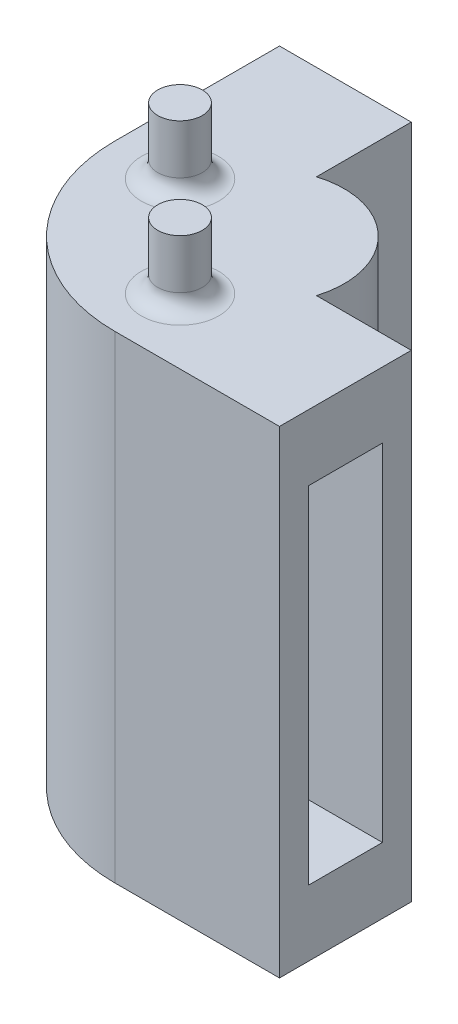
ISO-10303-21;
HEADER;
FILE_DESCRIPTION(('STEP AP214'),'2;1');
FILE_NAME('part.step','',(''),(''),'','','');
FILE_SCHEMA(('AUTOMOTIVE_DESIGN { 1 0 10303 214 1 1 1 1 }'));
ENDSEC;
DATA;
#1=APPLICATION_CONTEXT('core data for automotive mechanical design processes');
#2=APPLICATION_PROTOCOL_DEFINITION('international standard','automotive_design',2000,#1);
#3=PRODUCT_CONTEXT('',#1,'mechanical');
#4=PRODUCT('Part','Part','',(#3));
#5=PRODUCT_RELATED_PRODUCT_CATEGORY('part','',(#4));
#6=PRODUCT_DEFINITION_FORMATION('','',#4);
#7=PRODUCT_DEFINITION_CONTEXT('part definition',#1,'design');
#8=PRODUCT_DEFINITION('design','',#6,#7);
#9=PRODUCT_DEFINITION_SHAPE('','',#8);
#10=(LENGTH_UNIT() NAMED_UNIT(*) SI_UNIT(.MILLI.,.METRE.));
#11=(NAMED_UNIT(*) PLANE_ANGLE_UNIT() SI_UNIT($,.RADIAN.));
#12=(NAMED_UNIT(*) SI_UNIT($,.STERADIAN.) SOLID_ANGLE_UNIT());
#13=UNCERTAINTY_MEASURE_WITH_UNIT(LENGTH_MEASURE(1.E-05),#10,'distance_accuracy_value','');
#14=(GEOMETRIC_REPRESENTATION_CONTEXT(3) GLOBAL_UNCERTAINTY_ASSIGNED_CONTEXT((#13)) GLOBAL_UNIT_ASSIGNED_CONTEXT((#10,
#11,#12)) REPRESENTATION_CONTEXT('',''));
#15=CARTESIAN_POINT('',(0.,0.,0.));
#16=DIRECTION('',(0.,0.,1.));
#17=DIRECTION('',(1.,0.,0.));
#18=AXIS2_PLACEMENT_3D('',#15,#16,#17);
#19=CARTESIAN_POINT('',(20.,29.,0.));
#20=DIRECTION('',(1.,0.,0.));
#21=DIRECTION('',(0.,0.,-1.));
#22=AXIS2_PLACEMENT_3D('',#19,#20,#21);
#23=PLANE('',#22);
#24=DIRECTION('',(0.,0.,1.));
#25=VECTOR('',#24,1.);
#26=CARTESIAN_POINT('',(20.,0.,0.));
#27=LINE('',#26,#25);
#28=CARTESIAN_POINT('',(20.,0.,-8.00000000000009));
#29=VERTEX_POINT('',#28);
#30=CARTESIAN_POINT('',(20.,0.,0.));
#31=VERTEX_POINT('',#30);
#32=EDGE_CURVE('E214',#29,#31,#27,.T.);
#33=ORIENTED_EDGE('',*,*,#32,.F.);
#34=DIRECTION('',(0.,-1.,0.));
#35=VECTOR('',#34,1.);
#36=CARTESIAN_POINT('',(20.,29.,-8.00000000000009));
#37=LINE('',#36,#35);
#38=CARTESIAN_POINT('',(20.,29.,-8.00000000000009));
#39=VERTEX_POINT('',#38);
#40=EDGE_CURVE('E245',#39,#29,#37,.T.);
#41=ORIENTED_EDGE('',*,*,#40,.F.);
#42=DIRECTION('',(0.,0.,1.));
#43=VECTOR('',#42,1.);
#44=CARTESIAN_POINT('',(20.,29.,0.));
#45=LINE('',#44,#43);
#46=CARTESIAN_POINT('',(20.,29.,0.));
#47=VERTEX_POINT('',#46);
#48=EDGE_CURVE('E220',#39,#47,#45,.T.);
#49=ORIENTED_EDGE('',*,*,#48,.T.);
#50=DIRECTION('',(0.,-1.,0.));
#51=VECTOR('',#50,1.);
#52=CARTESIAN_POINT('',(20.,29.,0.));
#53=LINE('',#52,#51);
#54=EDGE_CURVE('E230',#47,#31,#53,.T.);
#55=ORIENTED_EDGE('',*,*,#54,.T.);
#56=EDGE_LOOP('',(#33,#41,#49,#55));
#57=FACE_BOUND('',#56,.T.);
#58=DIRECTION('',(0.,0.,1.));
#59=VECTOR('',#58,1.);
#60=CARTESIAN_POINT('',(20.,4.,-6.25000000000008));
#61=LINE('',#60,#59);
#62=CARTESIAN_POINT('',(20.,4.,-6.25000000000008));
#63=VERTEX_POINT('',#62);
#64=CARTESIAN_POINT('',(20.,4.,-1.75000000000006));
#65=VERTEX_POINT('',#64);
#66=EDGE_CURVE('E180',#63,#65,#61,.T.);
#67=ORIENTED_EDGE('',*,*,#66,.T.);
#68=DIRECTION('',(0.,1.,0.));
#69=VECTOR('',#68,1.);
#70=CARTESIAN_POINT('',(20.,4.,-1.75000000000008));
#71=LINE('',#70,#69);
#72=CARTESIAN_POINT('',(20.,25.,-1.75000000000008));
#73=VERTEX_POINT('',#72);
#74=EDGE_CURVE('E50',#65,#73,#71,.T.);
#75=ORIENTED_EDGE('',*,*,#74,.T.);
#76=DIRECTION('',(0.,0.,-1.));
#77=VECTOR('',#76,1.);
#78=CARTESIAN_POINT('',(20.,25.,-6.25000000000008));
#79=LINE('',#78,#77);
#80=CARTESIAN_POINT('',(20.,25.,-6.25000000000008));
#81=VERTEX_POINT('',#80);
#82=EDGE_CURVE('E168',#73,#81,#79,.T.);
#83=ORIENTED_EDGE('',*,*,#82,.T.);
#84=DIRECTION('',(0.,-1.,0.));
#85=VECTOR('',#84,1.);
#86=CARTESIAN_POINT('',(20.,4.,-6.25000000000008));
#87=LINE('',#86,#85);
#88=EDGE_CURVE('E171',#81,#63,#87,.T.);
#89=ORIENTED_EDGE('',*,*,#88,.T.);
#90=EDGE_LOOP('',(#67,#75,#83,#89));
#91=FACE_BOUND('',#90,.T.);
#92=ADVANCED_FACE('F35',(#57,#91),#23,.T.);
#93=CARTESIAN_POINT('',(0.,29.,-20.));
#94=DIRECTION('',(0.,0.,1.));
#95=DIRECTION('',(1.,0.,0.));
#96=AXIS2_PLACEMENT_3D('',#93,#94,#95);
#97=PLANE('',#96);
#98=DIRECTION('',(1.,0.,0.));
#99=VECTOR('',#98,1.);
#100=CARTESIAN_POINT('',(6.25,25.,-20.));
#101=LINE('',#100,#99);
#102=CARTESIAN_POINT('',(1.75,25.,-20.));
#103=VERTEX_POINT('',#102);
#104=CARTESIAN_POINT('',(6.25,25.,-20.));
#105=VERTEX_POINT('',#104);
#106=EDGE_CURVE('E204',#103,#105,#101,.T.);
#107=ORIENTED_EDGE('',*,*,#106,.F.);
#108=DIRECTION('',(0.,1.,0.));
#109=VECTOR('',#108,1.);
#110=CARTESIAN_POINT('',(1.75,4.,-20.));
#111=LINE('',#110,#109);
#112=CARTESIAN_POINT('',(1.75,4.,-20.));
#113=VERTEX_POINT('',#112);
#114=EDGE_CURVE('E58',#113,#103,#111,.T.);
#115=ORIENTED_EDGE('',*,*,#114,.F.);
#116=DIRECTION('',(-1.,0.,0.));
#117=VECTOR('',#116,1.);
#118=CARTESIAN_POINT('',(6.25,4.,-20.));
#119=LINE('',#118,#117);
#120=CARTESIAN_POINT('',(6.25,4.,-20.));
#121=VERTEX_POINT('',#120);
#122=EDGE_CURVE('E193',#121,#113,#119,.T.);
#123=ORIENTED_EDGE('',*,*,#122,.F.);
#124=DIRECTION('',(0.,-1.,0.));
#125=VECTOR('',#124,1.);
#126=CARTESIAN_POINT('',(6.25,4.,-20.));
#127=LINE('',#126,#125);
#128=EDGE_CURVE('E207',#105,#121,#127,.T.);
#129=ORIENTED_EDGE('',*,*,#128,.F.);
#130=EDGE_LOOP('',(#107,#115,#123,#129));
#131=FACE_BOUND('',#130,.T.);
#132=DIRECTION('',(-1.,0.,0.));
#133=VECTOR('',#132,1.);
#134=CARTESIAN_POINT('',(0.,0.,-20.));
#135=LINE('',#134,#133);
#136=CARTESIAN_POINT('',(8.,0.,-20.));
#137=VERTEX_POINT('',#136);
#138=CARTESIAN_POINT('',(0.,0.,-20.));
#139=VERTEX_POINT('',#138);
#140=EDGE_CURVE('E247',#137,#139,#135,.T.);
#141=ORIENTED_EDGE('',*,*,#140,.T.);
#142=DIRECTION('',(0.,-1.,0.));
#143=VECTOR('',#142,1.);
#144=CARTESIAN_POINT('',(0.,29.,-20.));
#145=LINE('',#144,#143);
#146=CARTESIAN_POINT('',(0.,29.,-20.));
#147=VERTEX_POINT('',#146);
#148=EDGE_CURVE('E278',#147,#139,#145,.T.);
#149=ORIENTED_EDGE('',*,*,#148,.F.);
#150=DIRECTION('',(-1.,0.,0.));
#151=VECTOR('',#150,1.);
#152=CARTESIAN_POINT('',(0.,29.,-20.));
#153=LINE('',#152,#151);
#154=CARTESIAN_POINT('',(8.,29.,-20.));
#155=VERTEX_POINT('',#154);
#156=EDGE_CURVE('E248',#155,#147,#153,.T.);
#157=ORIENTED_EDGE('',*,*,#156,.F.);
#158=DIRECTION('',(0.,-1.,0.));
#159=VECTOR('',#158,1.);
#160=CARTESIAN_POINT('',(8.,29.,-20.));
#161=LINE('',#160,#159);
#162=EDGE_CURVE('E260',#155,#137,#161,.T.);
#163=ORIENTED_EDGE('',*,*,#162,.T.);
#164=EDGE_LOOP('',(#141,#149,#157,#163));
#165=FACE_BOUND('',#164,.T.);
#166=ADVANCED_FACE('F322',(#131,#165),#97,.F.);
#167=CARTESIAN_POINT('',(0.,29.,-10.0000000000001));
#168=DIRECTION('',(1.,0.,0.));
#169=DIRECTION('',(0.,0.,-1.));
#170=AXIS2_PLACEMENT_3D('',#167,#168,#169);
#171=PLANE('',#170);
#172=DIRECTION('',(0.,0.,1.));
#173=VECTOR('',#172,1.);
#174=CARTESIAN_POINT('',(0.,0.,-10.0000000000001));
#175=LINE('',#174,#173);
#176=CARTESIAN_POINT('',(0.,0.,-10.0000000000001));
#177=VERTEX_POINT('',#176);
#178=EDGE_CURVE('E263',#139,#177,#175,.T.);
#179=ORIENTED_EDGE('',*,*,#178,.T.);
#180=DIRECTION('',(0.,-1.,0.));
#181=VECTOR('',#180,1.);
#182=CARTESIAN_POINT('',(0.,29.,-10.0000000000001));
#183=LINE('',#182,#181);
#184=CARTESIAN_POINT('',(0.,29.,-10.0000000000001));
#185=VERTEX_POINT('',#184);
#186=EDGE_CURVE('E275',#185,#177,#183,.T.);
#187=ORIENTED_EDGE('',*,*,#186,.F.);
#188=DIRECTION('',(0.,0.,1.));
#189=VECTOR('',#188,1.);
#190=CARTESIAN_POINT('',(0.,29.,-10.0000000000001));
#191=LINE('',#190,#189);
#192=EDGE_CURVE('E251',#147,#185,#191,.T.);
#193=ORIENTED_EDGE('',*,*,#192,.F.);
#194=ORIENTED_EDGE('',*,*,#148,.T.);
#195=EDGE_LOOP('',(#179,#187,#193,#194));
#196=FACE_BOUND('',#195,.T.);
#197=ADVANCED_FACE('F328',(#196),#171,.F.);
#198=CARTESIAN_POINT('',(10.,29.,-10.));
#199=DIRECTION('',(0.,-1.,0.));
#200=DIRECTION('',(0.,0.,-1.));
#201=AXIS2_PLACEMENT_3D('',#198,#199,#200);
#202=CYLINDRICAL_SURFACE('',#201,10.);
#203=CARTESIAN_POINT('',(10.,0.,-10.));
#204=DIRECTION('',(0.,1.,0.));
#205=DIRECTION('',(0.,0.,-1.));
#206=AXIS2_PLACEMENT_3D('',#203,#204,#205);
#207=CIRCLE('',#206,10.);
#208=CARTESIAN_POINT('',(10.0000000000001,0.,0.));
#209=VERTEX_POINT('',#208);
#210=EDGE_CURVE('E265',#177,#209,#207,.T.);
#211=ORIENTED_EDGE('',*,*,#210,.T.);
#212=DIRECTION('',(0.,-1.,0.));
#213=VECTOR('',#212,1.);
#214=CARTESIAN_POINT('',(10.0000000000001,29.,0.));
#215=LINE('',#214,#213);
#216=CARTESIAN_POINT('',(10.0000000000001,29.,0.));
#217=VERTEX_POINT('',#216);
#218=EDGE_CURVE('E239',#217,#209,#215,.T.);
#219=ORIENTED_EDGE('',*,*,#218,.F.);
#220=CARTESIAN_POINT('',(10.,29.,-10.));
#221=DIRECTION('',(0.,1.,0.));
#222=DIRECTION('',(0.,0.,-1.));
#223=AXIS2_PLACEMENT_3D('',#220,#221,#222);
#224=CIRCLE('',#223,10.);
#225=EDGE_CURVE('E254',#185,#217,#224,.T.);
#226=ORIENTED_EDGE('',*,*,#225,.F.);
#227=ORIENTED_EDGE('',*,*,#186,.T.);
#228=EDGE_LOOP('',(#211,#219,#226,#227));
#229=FACE_BOUND('',#228,.T.);
#230=ADVANCED_FACE('F350',(#229),#202,.T.);
#231=CARTESIAN_POINT('',(9.46446609406726,29.,-9.4644660940673));
#232=DIRECTION('',(0.,-1.,0.));
#233=DIRECTION('',(0.,0.,-1.));
#234=AXIS2_PLACEMENT_3D('',#231,#232,#233);
#235=CYLINDRICAL_SURFACE('',#234,5.);
#236=CARTESIAN_POINT('',(9.46446609406726,0.,-9.4644660940673));
#237=DIRECTION('',(0.,1.,0.));
#238=DIRECTION('',(0.,0.,1.));
#239=AXIS2_PLACEMENT_3D('',#236,#237,#238);
#240=CIRCLE('',#239,5.);
#241=CARTESIAN_POINT('',(14.2451918819919,0.,-8.00000000000006));
#242=VERTEX_POINT('',#241);
#243=CARTESIAN_POINT('',(8.,0.,-14.2451918819919));
#244=VERTEX_POINT('',#243);
#245=EDGE_CURVE('E267',#242,#244,#240,.T.);
#246=ORIENTED_EDGE('',*,*,#245,.T.);
#247=DIRECTION('',(0.,-1.,0.));
#248=VECTOR('',#247,1.);
#249=CARTESIAN_POINT('',(8.,29.,-14.2451918819919));
#250=LINE('',#249,#248);
#251=CARTESIAN_POINT('',(8.,29.,-14.2451918819919));
#252=VERTEX_POINT('',#251);
#253=EDGE_CURVE('E272',#252,#244,#250,.T.);
#254=ORIENTED_EDGE('',*,*,#253,.F.);
#255=CARTESIAN_POINT('',(9.46446609406726,29.,-9.4644660940673));
#256=DIRECTION('',(0.,1.,0.));
#257=DIRECTION('',(0.,0.,1.));
#258=AXIS2_PLACEMENT_3D('',#255,#256,#257);
#259=CIRCLE('',#258,5.);
#260=CARTESIAN_POINT('',(14.2451918819919,29.,-8.00000000000006));
#261=VERTEX_POINT('',#260);
#262=EDGE_CURVE('E256',#261,#252,#259,.T.);
#263=ORIENTED_EDGE('',*,*,#262,.F.);
#264=DIRECTION('',(0.,-1.,0.));
#265=VECTOR('',#264,1.);
#266=CARTESIAN_POINT('',(14.2451918819919,29.,-8.00000000000006));
#267=LINE('',#266,#265);
#268=EDGE_CURVE('E242',#261,#242,#267,.T.);
#269=ORIENTED_EDGE('',*,*,#268,.T.);
#270=EDGE_LOOP('',(#246,#254,#263,#269));
#271=FACE_BOUND('',#270,.T.);
#272=ADVANCED_FACE('F346',(#271),#235,.T.);
#273=CARTESIAN_POINT('',(8.,29.,-20.));
#274=DIRECTION('',(-1.,0.,0.));
#275=DIRECTION('',(0.,0.,1.));
#276=AXIS2_PLACEMENT_3D('',#273,#274,#275);
#277=PLANE('',#276);
#278=DIRECTION('',(0.,0.,-1.));
#279=VECTOR('',#278,1.);
#280=CARTESIAN_POINT('',(8.,0.,-20.));
#281=LINE('',#280,#279);
#282=EDGE_CURVE('E252',#244,#137,#281,.T.);
#283=ORIENTED_EDGE('',*,*,#282,.T.);
#284=ORIENTED_EDGE('',*,*,#162,.F.);
#285=DIRECTION('',(0.,0.,-1.));
#286=VECTOR('',#285,1.);
#287=CARTESIAN_POINT('',(8.,29.,-20.));
#288=LINE('',#287,#286);
#289=EDGE_CURVE('E258',#252,#155,#288,.T.);
#290=ORIENTED_EDGE('',*,*,#289,.F.);
#291=ORIENTED_EDGE('',*,*,#253,.T.);
#292=EDGE_LOOP('',(#283,#284,#290,#291));
#293=FACE_BOUND('',#292,.T.);
#294=ADVANCED_FACE('F340',(#293),#277,.F.);
#295=CARTESIAN_POINT('',(9.46446609406726,29.,-9.4644660940673));
#296=DIRECTION('',(0.,1.,0.));
#297=DIRECTION('',(0.,0.,1.));
#298=AXIS2_PLACEMENT_3D('',#295,#296,#297);
#299=PLANE('',#298);
#300=CARTESIAN_POINT('',(3.96206227824654,29.,-9.99913919830783));
#301=DIRECTION('',(0.,1.,0.));
#302=DIRECTION('',(0.,0.,1.));
#303=AXIS2_PLACEMENT_3D('',#300,#301,#302);
#304=CIRCLE('',#303,2.35);
#305=CARTESIAN_POINT('',(3.96206227824654,29.,-7.64913919830783));
#306=VERTEX_POINT('',#305);
#307=EDGE_CURVE('E43',#306,#306,#304,.F.);
#308=ORIENTED_EDGE('',*,*,#307,.T.);
#309=EDGE_LOOP('',(#308));
#310=FACE_BOUND('',#309,.T.);
#311=CARTESIAN_POINT('',(9.99913919830782,29.,-3.96206227824654));
#312=DIRECTION('',(0.,1.,0.));
#313=DIRECTION('',(0.,0.,1.));
#314=AXIS2_PLACEMENT_3D('',#311,#312,#313);
#315=CIRCLE('',#314,2.35);
#316=CARTESIAN_POINT('',(9.99913919830782,29.,-1.61206227824654));
#317=VERTEX_POINT('',#316);
#318=EDGE_CURVE('E284',#317,#317,#315,.F.);
#319=ORIENTED_EDGE('',*,*,#318,.T.);
#320=EDGE_LOOP('',(#319));
#321=FACE_BOUND('',#320,.T.);
#322=ORIENTED_EDGE('',*,*,#156,.T.);
#323=ORIENTED_EDGE('',*,*,#192,.T.);
#324=ORIENTED_EDGE('',*,*,#225,.T.);
#325=DIRECTION('',(-1.,0.,0.));
#326=VECTOR('',#325,1.);
#327=CARTESIAN_POINT('',(10.0000000000001,29.,0.));
#328=LINE('',#327,#326);
#329=EDGE_CURVE('E227',#47,#217,#328,.T.);
#330=ORIENTED_EDGE('',*,*,#329,.F.);
#331=ORIENTED_EDGE('',*,*,#48,.F.);
#332=DIRECTION('',(1.,0.,0.));
#333=VECTOR('',#332,1.);
#334=CARTESIAN_POINT('',(20.,29.,-8.00000000000009));
#335=LINE('',#334,#333);
#336=EDGE_CURVE('E223',#261,#39,#335,.T.);
#337=ORIENTED_EDGE('',*,*,#336,.F.);
#338=ORIENTED_EDGE('',*,*,#262,.T.);
#339=ORIENTED_EDGE('',*,*,#289,.T.);
#340=EDGE_LOOP('',(#322,#323,#324,#330,#331,#337,#338,#339));
#341=FACE_BOUND('',#340,.T.);
#342=ADVANCED_FACE('F289',(#310,#321,#341),#299,.T.);
#343=CARTESIAN_POINT('',(9.46446609406726,0.,-9.4644660940673));
#344=DIRECTION('',(0.,1.,0.));
#345=DIRECTION('',(0.,0.,1.));
#346=AXIS2_PLACEMENT_3D('',#343,#344,#345);
#347=PLANE('',#346);
#348=ORIENTED_EDGE('',*,*,#140,.F.);
#349=ORIENTED_EDGE('',*,*,#282,.F.);
#350=ORIENTED_EDGE('',*,*,#245,.F.);
#351=DIRECTION('',(1.,0.,0.));
#352=VECTOR('',#351,1.);
#353=CARTESIAN_POINT('',(20.,0.,-8.00000000000009));
#354=LINE('',#353,#352);
#355=EDGE_CURVE('E233',#242,#29,#354,.T.);
#356=ORIENTED_EDGE('',*,*,#355,.T.);
#357=ORIENTED_EDGE('',*,*,#32,.T.);
#358=DIRECTION('',(-1.,0.,0.));
#359=VECTOR('',#358,1.);
#360=CARTESIAN_POINT('',(10.0000000000001,0.,0.));
#361=LINE('',#360,#359);
#362=EDGE_CURVE('E224',#31,#209,#361,.T.);
#363=ORIENTED_EDGE('',*,*,#362,.T.);
#364=ORIENTED_EDGE('',*,*,#210,.F.);
#365=ORIENTED_EDGE('',*,*,#178,.F.);
#366=EDGE_LOOP('',(#348,#349,#350,#356,#357,#363,#364,#365));
#367=FACE_BOUND('',#366,.T.);
#368=ADVANCED_FACE('F339',(#367),#347,.F.);
#369=CARTESIAN_POINT('',(20.,29.,-8.00000000000009));
#370=DIRECTION('',(0.,0.,-1.));
#371=DIRECTION('',(-1.,0.,0.));
#372=AXIS2_PLACEMENT_3D('',#369,#370,#371);
#373=PLANE('',#372);
#374=ORIENTED_EDGE('',*,*,#355,.F.);
#375=ORIENTED_EDGE('',*,*,#268,.F.);
#376=ORIENTED_EDGE('',*,*,#336,.T.);
#377=ORIENTED_EDGE('',*,*,#40,.T.);
#378=EDGE_LOOP('',(#374,#375,#376,#377));
#379=FACE_BOUND('',#378,.T.);
#380=ADVANCED_FACE('F335',(#379),#373,.T.);
#381=CARTESIAN_POINT('',(10.0000000000001,29.,0.));
#382=DIRECTION('',(0.,0.,1.));
#383=DIRECTION('',(1.,0.,0.));
#384=AXIS2_PLACEMENT_3D('',#381,#382,#383);
#385=PLANE('',#384);
#386=ORIENTED_EDGE('',*,*,#362,.F.);
#387=ORIENTED_EDGE('',*,*,#54,.F.);
#388=ORIENTED_EDGE('',*,*,#329,.T.);
#389=ORIENTED_EDGE('',*,*,#218,.T.);
#390=EDGE_LOOP('',(#386,#387,#388,#389));
#391=FACE_BOUND('',#390,.T.);
#392=ADVANCED_FACE('F367',(#391),#385,.T.);
#393=CARTESIAN_POINT('',(1.75,4.,-14.));
#394=DIRECTION('',(-1.,0.,0.));
#395=DIRECTION('',(0.,0.,1.));
#396=AXIS2_PLACEMENT_3D('',#393,#394,#395);
#397=PLANE('',#396);
#398=ORIENTED_EDGE('',*,*,#114,.T.);
#399=DIRECTION('',(0.,0.,-1.));
#400=VECTOR('',#399,1.);
#401=CARTESIAN_POINT('',(1.75,25.,-14.));
#402=LINE('',#401,#400);
#403=CARTESIAN_POINT('',(1.75,25.,-14.));
#404=VERTEX_POINT('',#403);
#405=EDGE_CURVE('E202',#404,#103,#402,.T.);
#406=ORIENTED_EDGE('',*,*,#405,.F.);
#407=DIRECTION('',(0.,1.,0.));
#408=VECTOR('',#407,1.);
#409=CARTESIAN_POINT('',(1.75,4.,-14.));
#410=LINE('',#409,#408);
#411=CARTESIAN_POINT('',(1.75,4.,-14.));
#412=VERTEX_POINT('',#411);
#413=EDGE_CURVE('E189',#412,#404,#410,.T.);
#414=ORIENTED_EDGE('',*,*,#413,.F.);
#415=DIRECTION('',(0.,0.,-1.));
#416=VECTOR('',#415,1.);
#417=CARTESIAN_POINT('',(1.75,4.,-14.));
#418=LINE('',#417,#416);
#419=EDGE_CURVE('E212',#412,#113,#418,.T.);
#420=ORIENTED_EDGE('',*,*,#419,.T.);
#421=EDGE_LOOP('',(#398,#406,#414,#420));
#422=FACE_BOUND('',#421,.T.);
#423=ADVANCED_FACE('F385',(#422),#397,.F.);
#424=CARTESIAN_POINT('',(6.25,4.,-14.));
#425=DIRECTION('',(0.,-1.,0.));
#426=DIRECTION('',(0.,0.,-1.));
#427=AXIS2_PLACEMENT_3D('',#424,#425,#426);
#428=PLANE('',#427);
#429=ORIENTED_EDGE('',*,*,#122,.T.);
#430=ORIENTED_EDGE('',*,*,#419,.F.);
#431=DIRECTION('',(-1.,0.,0.));
#432=VECTOR('',#431,1.);
#433=CARTESIAN_POINT('',(6.25,4.,-14.));
#434=LINE('',#433,#432);
#435=CARTESIAN_POINT('',(6.25,4.,-14.));
#436=VERTEX_POINT('',#435);
#437=EDGE_CURVE('E199',#436,#412,#434,.T.);
#438=ORIENTED_EDGE('',*,*,#437,.F.);
#439=DIRECTION('',(0.,0.,-1.));
#440=VECTOR('',#439,1.);
#441=CARTESIAN_POINT('',(6.25,4.,-14.));
#442=LINE('',#441,#440);
#443=EDGE_CURVE('E215',#436,#121,#442,.T.);
#444=ORIENTED_EDGE('',*,*,#443,.T.);
#445=EDGE_LOOP('',(#429,#430,#438,#444));
#446=FACE_BOUND('',#445,.T.);
#447=ADVANCED_FACE('F389',(#446),#428,.F.);
#448=CARTESIAN_POINT('',(6.25,4.,-14.));
#449=DIRECTION('',(1.,0.,0.));
#450=DIRECTION('',(0.,0.,-1.));
#451=AXIS2_PLACEMENT_3D('',#448,#449,#450);
#452=PLANE('',#451);
#453=ORIENTED_EDGE('',*,*,#128,.T.);
#454=ORIENTED_EDGE('',*,*,#443,.F.);
#455=DIRECTION('',(0.,-1.,0.));
#456=VECTOR('',#455,1.);
#457=CARTESIAN_POINT('',(6.25,4.,-14.));
#458=LINE('',#457,#456);
#459=CARTESIAN_POINT('',(6.25,25.,-14.));
#460=VERTEX_POINT('',#459);
#461=EDGE_CURVE('E196',#460,#436,#458,.T.);
#462=ORIENTED_EDGE('',*,*,#461,.F.);
#463=DIRECTION('',(0.,0.,-1.));
#464=VECTOR('',#463,1.);
#465=CARTESIAN_POINT('',(6.25,25.,-14.));
#466=LINE('',#465,#464);
#467=EDGE_CURVE('E217',#460,#105,#466,.T.);
#468=ORIENTED_EDGE('',*,*,#467,.T.);
#469=EDGE_LOOP('',(#453,#454,#462,#468));
#470=FACE_BOUND('',#469,.T.);
#471=ADVANCED_FACE('F396',(#470),#452,.F.);
#472=CARTESIAN_POINT('',(6.25,25.,-14.));
#473=DIRECTION('',(0.,1.,0.));
#474=DIRECTION('',(0.,0.,1.));
#475=AXIS2_PLACEMENT_3D('',#472,#473,#474);
#476=PLANE('',#475);
#477=ORIENTED_EDGE('',*,*,#106,.T.);
#478=ORIENTED_EDGE('',*,*,#467,.F.);
#479=DIRECTION('',(1.,0.,0.));
#480=VECTOR('',#479,1.);
#481=CARTESIAN_POINT('',(6.25,25.,-14.));
#482=LINE('',#481,#480);
#483=EDGE_CURVE('E192',#404,#460,#482,.T.);
#484=ORIENTED_EDGE('',*,*,#483,.F.);
#485=ORIENTED_EDGE('',*,*,#405,.T.);
#486=EDGE_LOOP('',(#477,#478,#484,#485));
#487=FACE_BOUND('',#486,.T.);
#488=ADVANCED_FACE('F392',(#487),#476,.F.);
#489=CARTESIAN_POINT('',(0.,0.,-14.));
#490=DIRECTION('',(0.,0.,1.));
#491=DIRECTION('',(1.,0.,0.));
#492=AXIS2_PLACEMENT_3D('',#489,#490,#491);
#493=PLANE('',#492);
#494=ORIENTED_EDGE('',*,*,#413,.T.);
#495=ORIENTED_EDGE('',*,*,#483,.T.);
#496=ORIENTED_EDGE('',*,*,#461,.T.);
#497=ORIENTED_EDGE('',*,*,#437,.T.);
#498=EDGE_LOOP('',(#494,#495,#496,#497));
#499=FACE_BOUND('',#498,.T.);
#500=ADVANCED_FACE('F395',(#499),#493,.F.);
#501=CARTESIAN_POINT('',(14.,4.,-1.75000000000006));
#502=DIRECTION('',(0.,0.,-1.));
#503=DIRECTION('',(-1.,0.,0.));
#504=AXIS2_PLACEMENT_3D('',#501,#502,#503);
#505=PLANE('',#504);
#506=ORIENTED_EDGE('',*,*,#74,.F.);
#507=DIRECTION('',(1.,0.,0.));
#508=VECTOR('',#507,1.);
#509=CARTESIAN_POINT('',(14.,4.,-1.75000000000006));
#510=LINE('',#509,#508);
#511=CARTESIAN_POINT('',(14.,4.,-1.75000000000006));
#512=VERTEX_POINT('',#511);
#513=EDGE_CURVE('E153',#512,#65,#510,.T.);
#514=ORIENTED_EDGE('',*,*,#513,.F.);
#515=DIRECTION('',(0.,1.,0.));
#516=VECTOR('',#515,1.);
#517=CARTESIAN_POINT('',(14.,4.,-1.75000000000006));
#518=LINE('',#517,#516);
#519=CARTESIAN_POINT('',(14.,25.,-1.75000000000006));
#520=VERTEX_POINT('',#519);
#521=EDGE_CURVE('E160',#512,#520,#518,.T.);
#522=ORIENTED_EDGE('',*,*,#521,.T.);
#523=DIRECTION('',(1.,0.,0.));
#524=VECTOR('',#523,1.);
#525=CARTESIAN_POINT('',(14.,25.,-1.75000000000006));
#526=LINE('',#525,#524);
#527=EDGE_CURVE('E184',#520,#73,#526,.T.);
#528=ORIENTED_EDGE('',*,*,#527,.T.);
#529=EDGE_LOOP('',(#506,#514,#522,#528));
#530=FACE_BOUND('',#529,.T.);
#531=ADVANCED_FACE('F163',(#530),#505,.T.);
#532=CARTESIAN_POINT('',(14.,25.,-6.25000000000006));
#533=DIRECTION('',(0.,-1.,0.));
#534=DIRECTION('',(0.,0.,-1.));
#535=AXIS2_PLACEMENT_3D('',#532,#533,#534);
#536=PLANE('',#535);
#537=ORIENTED_EDGE('',*,*,#82,.F.);
#538=ORIENTED_EDGE('',*,*,#527,.F.);
#539=DIRECTION('',(0.,0.,-1.));
#540=VECTOR('',#539,1.);
#541=CARTESIAN_POINT('',(14.,25.,-6.25000000000006));
#542=LINE('',#541,#540);
#543=CARTESIAN_POINT('',(14.,25.,-6.25000000000006));
#544=VERTEX_POINT('',#543);
#545=EDGE_CURVE('E165',#520,#544,#542,.T.);
#546=ORIENTED_EDGE('',*,*,#545,.T.);
#547=DIRECTION('',(1.,0.,0.));
#548=VECTOR('',#547,1.);
#549=CARTESIAN_POINT('',(14.,25.,-6.25000000000006));
#550=LINE('',#549,#548);
#551=EDGE_CURVE('E186',#544,#81,#550,.T.);
#552=ORIENTED_EDGE('',*,*,#551,.T.);
#553=EDGE_LOOP('',(#537,#538,#546,#552));
#554=FACE_BOUND('',#553,.T.);
#555=ADVANCED_FACE('F409',(#554),#536,.T.);
#556=CARTESIAN_POINT('',(14.,4.,-6.25000000000006));
#557=DIRECTION('',(0.,0.,1.));
#558=DIRECTION('',(1.,0.,0.));
#559=AXIS2_PLACEMENT_3D('',#556,#557,#558);
#560=PLANE('',#559);
#561=ORIENTED_EDGE('',*,*,#88,.F.);
#562=ORIENTED_EDGE('',*,*,#551,.F.);
#563=DIRECTION('',(0.,-1.,0.));
#564=VECTOR('',#563,1.);
#565=CARTESIAN_POINT('',(14.,4.,-6.25000000000006));
#566=LINE('',#565,#564);
#567=CARTESIAN_POINT('',(14.,4.,-6.25000000000006));
#568=VERTEX_POINT('',#567);
#569=EDGE_CURVE('E159',#544,#568,#566,.T.);
#570=ORIENTED_EDGE('',*,*,#569,.T.);
#571=DIRECTION('',(1.,0.,0.));
#572=VECTOR('',#571,1.);
#573=CARTESIAN_POINT('',(14.,4.,-6.25000000000006));
#574=LINE('',#573,#572);
#575=EDGE_CURVE('E155',#568,#63,#574,.T.);
#576=ORIENTED_EDGE('',*,*,#575,.T.);
#577=EDGE_LOOP('',(#561,#562,#570,#576));
#578=FACE_BOUND('',#577,.T.);
#579=ADVANCED_FACE('F412',(#578),#560,.T.);
#580=CARTESIAN_POINT('',(14.,4.,-6.25000000000006));
#581=DIRECTION('',(0.,1.,0.));
#582=DIRECTION('',(0.,0.,1.));
#583=AXIS2_PLACEMENT_3D('',#580,#581,#582);
#584=PLANE('',#583);
#585=ORIENTED_EDGE('',*,*,#66,.F.);
#586=ORIENTED_EDGE('',*,*,#575,.F.);
#587=DIRECTION('',(0.,0.,1.));
#588=VECTOR('',#587,1.);
#589=CARTESIAN_POINT('',(14.,4.,-6.25000000000006));
#590=LINE('',#589,#588);
#591=EDGE_CURVE('E150',#568,#512,#590,.T.);
#592=ORIENTED_EDGE('',*,*,#591,.T.);
#593=ORIENTED_EDGE('',*,*,#513,.T.);
#594=EDGE_LOOP('',(#585,#586,#592,#593));
#595=FACE_BOUND('',#594,.T.);
#596=ADVANCED_FACE('F152',(#595),#584,.T.);
#597=CARTESIAN_POINT('',(14.,0.,0.));
#598=DIRECTION('',(-1.,0.,0.));
#599=DIRECTION('',(0.,0.,-1.));
#600=AXIS2_PLACEMENT_3D('',#597,#598,#599);
#601=PLANE('',#600);
#602=ORIENTED_EDGE('',*,*,#521,.F.);
#603=ORIENTED_EDGE('',*,*,#591,.F.);
#604=ORIENTED_EDGE('',*,*,#569,.F.);
#605=ORIENTED_EDGE('',*,*,#545,.F.);
#606=EDGE_LOOP('',(#602,#603,#604,#605));
#607=FACE_BOUND('',#606,.T.);
#608=ADVANCED_FACE('F167',(#607),#601,.F.);
#609=CARTESIAN_POINT('',(9.99913919830782,33.,-3.96206227824654));
#610=DIRECTION('',(0.,-1.,0.));
#611=DIRECTION('',(0.,0.,-1.));
#612=AXIS2_PLACEMENT_3D('',#609,#610,#611);
#613=CYLINDRICAL_SURFACE('',#612,1.35);
#614=CARTESIAN_POINT('',(9.99913919830782,30.,-3.96206227824654));
#615=DIRECTION('',(0.,1.,0.));
#616=DIRECTION('',(0.,0.,1.));
#617=AXIS2_PLACEMENT_3D('',#614,#615,#616);
#618=CIRCLE('',#617,1.35);
#619=CARTESIAN_POINT('',(9.99913919830782,30.,-2.61206227824654));
#620=VERTEX_POINT('',#619);
#621=EDGE_CURVE('E11',#620,#620,#618,.T.);
#622=ORIENTED_EDGE('',*,*,#621,.T.);
#623=EDGE_LOOP('',(#622));
#624=FACE_BOUND('',#623,.T.);
#625=CARTESIAN_POINT('',(9.99913919830782,33.,-3.96206227824654));
#626=DIRECTION('',(0.,1.,0.));
#627=DIRECTION('',(0.,0.,1.));
#628=AXIS2_PLACEMENT_3D('',#625,#626,#627);
#629=CIRCLE('',#628,1.35);
#630=CARTESIAN_POINT('',(9.99913919830782,33.,-2.61206227824654));
#631=VERTEX_POINT('',#630);
#632=EDGE_CURVE('E174',#631,#631,#629,.T.);
#633=ORIENTED_EDGE('',*,*,#632,.F.);
#634=EDGE_LOOP('',(#633));
#635=FACE_BOUND('',#634,.T.);
#636=ADVANCED_FACE('F311',(#624,#635),#613,.T.);
#637=CARTESIAN_POINT('',(9.99913919830782,33.,-3.96206227824654));
#638=DIRECTION('',(0.,1.,0.));
#639=DIRECTION('',(0.,0.,1.));
#640=AXIS2_PLACEMENT_3D('',#637,#638,#639);
#641=PLANE('',#640);
#642=ORIENTED_EDGE('',*,*,#632,.T.);
#643=EDGE_LOOP('',(#642));
#644=FACE_BOUND('',#643,.T.);
#645=ADVANCED_FACE('F301',(#644),#641,.T.);
#646=CARTESIAN_POINT('',(3.96206227824654,33.,-9.99913919830783));
#647=DIRECTION('',(0.,-1.,0.));
#648=DIRECTION('',(0.,0.,-1.));
#649=AXIS2_PLACEMENT_3D('',#646,#647,#648);
#650=CYLINDRICAL_SURFACE('',#649,1.35);
#651=CARTESIAN_POINT('',(3.96206227824654,30.,-9.99913919830783));
#652=DIRECTION('',(0.,1.,0.));
#653=DIRECTION('',(0.,0.,1.));
#654=AXIS2_PLACEMENT_3D('',#651,#652,#653);
#655=CIRCLE('',#654,1.35);
#656=CARTESIAN_POINT('',(3.96206227824654,30.,-8.64913919830783));
#657=VERTEX_POINT('',#656);
#658=EDGE_CURVE('E281',#657,#657,#655,.T.);
#659=ORIENTED_EDGE('',*,*,#658,.T.);
#660=EDGE_LOOP('',(#659));
#661=FACE_BOUND('',#660,.T.);
#662=CARTESIAN_POINT('',(3.96206227824654,33.,-9.99913919830783));
#663=DIRECTION('',(0.,1.,0.));
#664=DIRECTION('',(0.,0.,-1.));
#665=AXIS2_PLACEMENT_3D('',#662,#663,#664);
#666=CIRCLE('',#665,1.35);
#667=CARTESIAN_POINT('',(3.96206227824654,33.,-11.3491391983078));
#668=VERTEX_POINT('',#667);
#669=EDGE_CURVE('E305',#668,#668,#666,.T.);
#670=ORIENTED_EDGE('',*,*,#669,.F.);
#671=EDGE_LOOP('',(#670));
#672=FACE_BOUND('',#671,.T.);
#673=ADVANCED_FACE('F298',(#661,#672),#650,.T.);
#674=CARTESIAN_POINT('',(3.96206227824654,33.,-9.99913919830783));
#675=DIRECTION('',(0.,-1.,0.));
#676=DIRECTION('',(0.,0.,-1.));
#677=AXIS2_PLACEMENT_3D('',#674,#675,#676);
#678=PLANE('',#677);
#679=ORIENTED_EDGE('',*,*,#669,.T.);
#680=EDGE_LOOP('',(#679));
#681=FACE_BOUND('',#680,.T.);
#682=ADVANCED_FACE('F295',(#681),#678,.F.);
#683=CARTESIAN_POINT('',(3.96206227824654,30.,-9.99913919830783));
#684=DIRECTION('',(0.,1.,0.));
#685=DIRECTION('',(0.,0.,1.));
#686=AXIS2_PLACEMENT_3D('',#683,#684,#685);
#687=TOROIDAL_SURFACE('',#686,2.35,1.);
#688=ORIENTED_EDGE('',*,*,#307,.F.);
#689=EDGE_LOOP('',(#688));
#690=FACE_BOUND('',#689,.T.);
#691=ORIENTED_EDGE('',*,*,#658,.F.);
#692=EDGE_LOOP('',(#691));
#693=FACE_BOUND('',#692,.T.);
#694=ADVANCED_FACE('F292',(#690,#693),#687,.F.);
#695=CARTESIAN_POINT('',(9.99913919830782,30.,-3.96206227824654));
#696=DIRECTION('',(0.,1.,0.));
#697=DIRECTION('',(0.,0.,1.));
#698=AXIS2_PLACEMENT_3D('',#695,#696,#697);
#699=TOROIDAL_SURFACE('',#698,2.35,1.);
#700=ORIENTED_EDGE('',*,*,#318,.F.);
#701=EDGE_LOOP('',(#700));
#702=FACE_BOUND('',#701,.T.);
#703=ORIENTED_EDGE('',*,*,#621,.F.);
#704=EDGE_LOOP('',(#703));
#705=FACE_BOUND('',#704,.T.);
#706=ADVANCED_FACE('F37',(#702,#705),#699,.F.);
#707=CLOSED_SHELL('',(#92,#166,#197,#230,#272,#294,#342,#368,#380,#392,#423,#447,#471,#488,#500,
#531,#555,#579,#596,#608,#636,#645,#673,#682,#694,#706));
#708=MANIFOLD_SOLID_BREP('B2',#707);
#709=ADVANCED_BREP_SHAPE_REPRESENTATION('',(#18,#708),#14);
#710=SHAPE_DEFINITION_REPRESENTATION(#9,#709);
ENDSEC;
END-ISO-10303-21;
